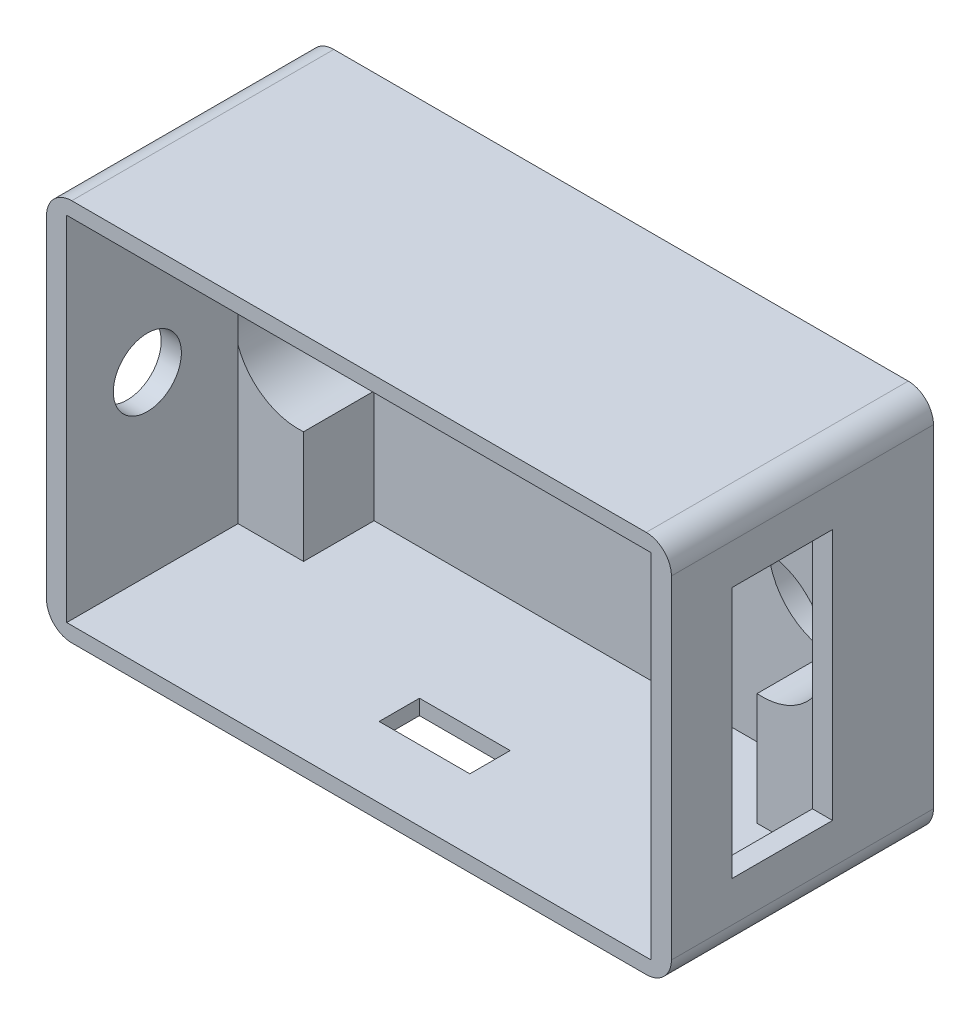
ISO-10303-21;
HEADER;
FILE_DESCRIPTION(('STEP AP214'),'2;1');
FILE_NAME('part.step','',(''),(''),'','','');
FILE_SCHEMA(('AUTOMOTIVE_DESIGN { 1 0 10303 214 1 1 1 1 }'));
ENDSEC;
DATA;
#1=APPLICATION_CONTEXT('core data for automotive mechanical design processes');
#2=APPLICATION_PROTOCOL_DEFINITION('international standard','automotive_design',2000,#1);
#3=PRODUCT_CONTEXT('',#1,'mechanical');
#4=PRODUCT('Part','Part','',(#3));
#5=PRODUCT_RELATED_PRODUCT_CATEGORY('part','',(#4));
#6=PRODUCT_DEFINITION_FORMATION('','',#4);
#7=PRODUCT_DEFINITION_CONTEXT('part definition',#1,'design');
#8=PRODUCT_DEFINITION('design','',#6,#7);
#9=PRODUCT_DEFINITION_SHAPE('','',#8);
#10=(LENGTH_UNIT() NAMED_UNIT(*) SI_UNIT(.MILLI.,.METRE.));
#11=(NAMED_UNIT(*) PLANE_ANGLE_UNIT() SI_UNIT($,.RADIAN.));
#12=(NAMED_UNIT(*) SI_UNIT($,.STERADIAN.) SOLID_ANGLE_UNIT());
#13=UNCERTAINTY_MEASURE_WITH_UNIT(LENGTH_MEASURE(1.E-05),#10,'distance_accuracy_value','');
#14=(GEOMETRIC_REPRESENTATION_CONTEXT(3) GLOBAL_UNCERTAINTY_ASSIGNED_CONTEXT((#13)) GLOBAL_UNIT_ASSIGNED_CONTEXT((#10,
#11,#12)) REPRESENTATION_CONTEXT('',''));
#15=CARTESIAN_POINT('',(0.,0.,0.));
#16=DIRECTION('',(0.,0.,1.));
#17=DIRECTION('',(1.,0.,0.));
#18=AXIS2_PLACEMENT_3D('',#15,#16,#17);
#19=CARTESIAN_POINT('',(0.,0.,9.));
#20=DIRECTION('',(0.,0.,1.));
#21=DIRECTION('',(1.,0.,0.));
#22=AXIS2_PLACEMENT_3D('',#19,#20,#21);
#23=PLANE('',#22);
#24=CARTESIAN_POINT('',(8.,19.,9.));
#25=DIRECTION('',(0.,0.,-1.));
#26=DIRECTION('',(-1.,0.,0.));
#27=AXIS2_PLACEMENT_3D('',#24,#25,#26);
#28=CIRCLE('',#27,6.375);
#29=CARTESIAN_POINT('',(2.,21.1542109924518,9.));
#30=VERTEX_POINT('',#29);
#31=CARTESIAN_POINT('',(8.5,25.3553619094431,9.));
#32=VERTEX_POINT('',#31);
#33=EDGE_CURVE('E324',#30,#32,#28,.T.);
#34=ORIENTED_EDGE('',*,*,#33,.T.);
#35=DIRECTION('',(0.,-1.,0.));
#36=VECTOR('',#35,1.);
#37=CARTESIAN_POINT('',(8.5,36.5,9.));
#38=LINE('',#37,#36);
#39=CARTESIAN_POINT('',(8.5,36.5,9.));
#40=VERTEX_POINT('',#39);
#41=EDGE_CURVE('E374',#40,#32,#38,.T.);
#42=ORIENTED_EDGE('',*,*,#41,.F.);
#43=DIRECTION('',(-1.,0.,0.));
#44=VECTOR('',#43,1.);
#45=CARTESIAN_POINT('',(2.,36.5,9.));
#46=LINE('',#45,#44);
#47=CARTESIAN_POINT('',(2.,36.5,9.));
#48=VERTEX_POINT('',#47);
#49=EDGE_CURVE('E412',#40,#48,#46,.T.);
#50=ORIENTED_EDGE('',*,*,#49,.T.);
#51=DIRECTION('',(0.,-1.,0.));
#52=VECTOR('',#51,1.);
#53=CARTESIAN_POINT('',(2.,36.5,9.));
#54=LINE('',#53,#52);
#55=EDGE_CURVE('E397',#48,#30,#54,.T.);
#56=ORIENTED_EDGE('',*,*,#55,.T.);
#57=EDGE_LOOP('',(#34,#42,#50,#56));
#58=FACE_BOUND('',#57,.T.);
#59=ADVANCED_FACE('F39',(#58),#23,.T.);
#60=CARTESIAN_POINT('',(54.,19.,9.));
#61=DIRECTION('',(0.,0.,-1.));
#62=DIRECTION('',(-1.,0.,0.));
#63=AXIS2_PLACEMENT_3D('',#60,#61,#62);
#64=CIRCLE('',#63,6.375);
#65=CARTESIAN_POINT('',(53.5,25.3553619094431,9.));
#66=VERTEX_POINT('',#65);
#67=CARTESIAN_POINT('',(60.,21.1542109924518,9.));
#68=VERTEX_POINT('',#67);
#69=EDGE_CURVE('E313',#66,#68,#64,.T.);
#70=ORIENTED_EDGE('',*,*,#69,.T.);
#71=DIRECTION('',(0.,1.,0.));
#72=VECTOR('',#71,1.);
#73=CARTESIAN_POINT('',(60.,36.5,9.));
#74=LINE('',#73,#72);
#75=CARTESIAN_POINT('',(60.,36.5,9.));
#76=VERTEX_POINT('',#75);
#77=EDGE_CURVE('E407',#68,#76,#74,.T.);
#78=ORIENTED_EDGE('',*,*,#77,.T.);
#79=CARTESIAN_POINT('',(53.5,36.5,9.));
#80=VERTEX_POINT('',#79);
#81=EDGE_CURVE('E413',#76,#80,#46,.T.);
#82=ORIENTED_EDGE('',*,*,#81,.T.);
#83=DIRECTION('',(0.,1.,0.));
#84=VECTOR('',#83,1.);
#85=CARTESIAN_POINT('',(53.5,36.5,9.));
#86=LINE('',#85,#84);
#87=EDGE_CURVE('E378',#66,#80,#86,.T.);
#88=ORIENTED_EDGE('',*,*,#87,.F.);
#89=EDGE_LOOP('',(#70,#78,#82,#88));
#90=FACE_BOUND('',#89,.T.);
#91=ADVANCED_FACE('F593',(#90),#23,.T.);
#92=CARTESIAN_POINT('',(8.5,36.5,2.));
#93=DIRECTION('',(-1.,0.,0.));
#94=DIRECTION('',(0.,-1.,0.));
#95=AXIS2_PLACEMENT_3D('',#92,#93,#94);
#96=PLANE('',#95);
#97=ORIENTED_EDGE('',*,*,#41,.T.);
#98=DIRECTION('',(0.,0.,-1.));
#99=VECTOR('',#98,1.);
#100=CARTESIAN_POINT('',(8.5,25.3553619094431,9.));
#101=LINE('',#100,#99);
#102=CARTESIAN_POINT('',(8.5,25.3553619094431,2.));
#103=VERTEX_POINT('',#102);
#104=EDGE_CURVE('E336',#32,#103,#101,.T.);
#105=ORIENTED_EDGE('',*,*,#104,.T.);
#106=DIRECTION('',(0.,-1.,0.));
#107=VECTOR('',#106,1.);
#108=CARTESIAN_POINT('',(8.5,36.5,2.));
#109=LINE('',#108,#107);
#110=CARTESIAN_POINT('',(8.5,36.5,2.));
#111=VERTEX_POINT('',#110);
#112=EDGE_CURVE('E355',#111,#103,#109,.T.);
#113=ORIENTED_EDGE('',*,*,#112,.F.);
#114=DIRECTION('',(0.,0.,1.));
#115=VECTOR('',#114,1.);
#116=CARTESIAN_POINT('',(8.5,36.5,2.));
#117=LINE('',#116,#115);
#118=EDGE_CURVE('E383',#111,#40,#117,.T.);
#119=ORIENTED_EDGE('',*,*,#118,.T.);
#120=EDGE_LOOP('',(#97,#105,#113,#119));
#121=FACE_BOUND('',#120,.T.);
#122=ADVANCED_FACE('F600',(#121),#96,.F.);
#123=CARTESIAN_POINT('',(53.5,36.5,2.));
#124=DIRECTION('',(1.,0.,0.));
#125=DIRECTION('',(0.,1.,0.));
#126=AXIS2_PLACEMENT_3D('',#123,#124,#125);
#127=PLANE('',#126);
#128=CARTESIAN_POINT('',(53.5,1.49999999999999,9.));
#129=VERTEX_POINT('',#128);
#130=CARTESIAN_POINT('',(53.5,12.6446380905569,9.));
#131=VERTEX_POINT('',#130);
#132=EDGE_CURVE('E379',#129,#131,#86,.T.);
#133=ORIENTED_EDGE('',*,*,#132,.T.);
#134=DIRECTION('',(0.,0.,-1.));
#135=VECTOR('',#134,1.);
#136=CARTESIAN_POINT('',(53.5,12.6446380905569,9.));
#137=LINE('',#136,#135);
#138=CARTESIAN_POINT('',(53.5,12.6446380905569,2.));
#139=VERTEX_POINT('',#138);
#140=EDGE_CURVE('E344',#131,#139,#137,.T.);
#141=ORIENTED_EDGE('',*,*,#140,.T.);
#142=DIRECTION('',(0.,1.,0.));
#143=VECTOR('',#142,1.);
#144=CARTESIAN_POINT('',(53.5,36.5,2.));
#145=LINE('',#144,#143);
#146=CARTESIAN_POINT('',(53.5,1.49999999999999,2.));
#147=VERTEX_POINT('',#146);
#148=EDGE_CURVE('E365',#147,#139,#145,.T.);
#149=ORIENTED_EDGE('',*,*,#148,.F.);
#150=DIRECTION('',(0.,0.,1.));
#151=VECTOR('',#150,1.);
#152=CARTESIAN_POINT('',(53.5,1.49999999999999,2.));
#153=LINE('',#152,#151);
#154=EDGE_CURVE('E391',#147,#129,#153,.T.);
#155=ORIENTED_EDGE('',*,*,#154,.T.);
#156=EDGE_LOOP('',(#133,#141,#149,#155));
#157=FACE_BOUND('',#156,.T.);
#158=ADVANCED_FACE('F620',(#157),#127,.F.);
#159=CARTESIAN_POINT('',(8.5,12.6446380905569,9.));
#160=VERTEX_POINT('',#159);
#161=CARTESIAN_POINT('',(2.,16.8457890075482,9.));
#162=VERTEX_POINT('',#161);
#163=EDGE_CURVE('E328',#160,#162,#28,.T.);
#164=ORIENTED_EDGE('',*,*,#163,.T.);
#165=CARTESIAN_POINT('',(2.,1.49999999999999,9.));
#166=VERTEX_POINT('',#165);
#167=EDGE_CURVE('E402',#162,#166,#54,.T.);
#168=ORIENTED_EDGE('',*,*,#167,.T.);
#169=DIRECTION('',(1.,0.,0.));
#170=VECTOR('',#169,1.);
#171=CARTESIAN_POINT('',(2.,1.49999999999999,9.));
#172=LINE('',#171,#170);
#173=CARTESIAN_POINT('',(8.5,1.49999999999999,9.));
#174=VERTEX_POINT('',#173);
#175=EDGE_CURVE('E403',#166,#174,#172,.T.);
#176=ORIENTED_EDGE('',*,*,#175,.T.);
#177=EDGE_CURVE('E354',#160,#174,#38,.T.);
#178=ORIENTED_EDGE('',*,*,#177,.F.);
#179=EDGE_LOOP('',(#164,#168,#176,#178));
#180=FACE_BOUND('',#179,.T.);
#181=ADVANCED_FACE('F602',(#180),#23,.T.);
#182=CARTESIAN_POINT('',(0.,0.,26.));
#183=DIRECTION('',(1.,0.,0.));
#184=DIRECTION('',(0.,0.,-1.));
#185=AXIS2_PLACEMENT_3D('',#182,#183,#184);
#186=PLANE('',#185);
#187=CARTESIAN_POINT('',(0.,19.,18.));
#188=DIRECTION('',(-1.,0.,0.));
#189=DIRECTION('',(0.,0.,1.));
#190=AXIS2_PLACEMENT_3D('',#187,#188,#189);
#191=CIRCLE('',#190,3.375);
#192=CARTESIAN_POINT('',(0.,19.,21.375));
#193=VERTEX_POINT('',#192);
#194=EDGE_CURVE('E275',#193,#193,#191,.T.);
#195=ORIENTED_EDGE('',*,*,#194,.F.);
#196=EDGE_LOOP('',(#195));
#197=FACE_BOUND('',#196,.T.);
#198=DIRECTION('',(0.,-1.,0.));
#199=VECTOR('',#198,1.);
#200=CARTESIAN_POINT('',(0.,0.,0.));
#201=LINE('',#200,#199);
#202=CARTESIAN_POINT('',(0.,35.5,0.));
#203=VERTEX_POINT('',#202);
#204=CARTESIAN_POINT('',(0.,2.5,0.));
#205=VERTEX_POINT('',#204);
#206=EDGE_CURVE('E435',#203,#205,#201,.T.);
#207=ORIENTED_EDGE('',*,*,#206,.T.);
#208=DIRECTION('',(0.,0.,-1.));
#209=VECTOR('',#208,1.);
#210=CARTESIAN_POINT('',(0.,2.5,26.));
#211=LINE('',#210,#209);
#212=CARTESIAN_POINT('',(0.,2.5,26.));
#213=VERTEX_POINT('',#212);
#214=EDGE_CURVE('E11',#205,#213,#211,.F.);
#215=ORIENTED_EDGE('',*,*,#214,.T.);
#216=DIRECTION('',(0.,-1.,0.));
#217=VECTOR('',#216,1.);
#218=CARTESIAN_POINT('',(0.,0.,26.));
#219=LINE('',#218,#217);
#220=CARTESIAN_POINT('',(0.,35.5,26.));
#221=VERTEX_POINT('',#220);
#222=EDGE_CURVE('E445',#221,#213,#219,.T.);
#223=ORIENTED_EDGE('',*,*,#222,.F.);
#224=DIRECTION('',(0.,0.,-1.));
#225=VECTOR('',#224,1.);
#226=CARTESIAN_POINT('',(0.,35.5,26.));
#227=LINE('',#226,#225);
#228=EDGE_CURVE('E48',#221,#203,#227,.T.);
#229=ORIENTED_EDGE('',*,*,#228,.T.);
#230=EDGE_LOOP('',(#207,#215,#223,#229));
#231=FACE_BOUND('',#230,.T.);
#232=ADVANCED_FACE('F559',(#197,#231),#186,.F.);
#233=CARTESIAN_POINT('',(0.,0.,26.));
#234=DIRECTION('',(0.,1.,0.));
#235=DIRECTION('',(0.,0.,1.));
#236=AXIS2_PLACEMENT_3D('',#233,#234,#235);
#237=PLANE('',#236);
#238=DIRECTION('',(1.,0.,0.));
#239=VECTOR('',#238,1.);
#240=CARTESIAN_POINT('',(26.,0.,15.));
#241=LINE('',#240,#239);
#242=CARTESIAN_POINT('',(26.,0.,15.));
#243=VERTEX_POINT('',#242);
#244=CARTESIAN_POINT('',(35.,0.,15.));
#245=VERTEX_POINT('',#244);
#246=EDGE_CURVE('E255',#243,#245,#241,.T.);
#247=ORIENTED_EDGE('',*,*,#246,.F.);
#248=DIRECTION('',(0.,0.,-1.));
#249=VECTOR('',#248,1.);
#250=CARTESIAN_POINT('',(26.,0.,19.));
#251=LINE('',#250,#249);
#252=CARTESIAN_POINT('',(26.,0.,19.));
#253=VERTEX_POINT('',#252);
#254=EDGE_CURVE('E261',#253,#243,#251,.T.);
#255=ORIENTED_EDGE('',*,*,#254,.F.);
#256=DIRECTION('',(-1.,0.,0.));
#257=VECTOR('',#256,1.);
#258=CARTESIAN_POINT('',(26.,0.,19.));
#259=LINE('',#258,#257);
#260=CARTESIAN_POINT('',(35.,0.,19.));
#261=VERTEX_POINT('',#260);
#262=EDGE_CURVE('E265',#261,#253,#259,.T.);
#263=ORIENTED_EDGE('',*,*,#262,.F.);
#264=DIRECTION('',(0.,0.,1.));
#265=VECTOR('',#264,1.);
#266=CARTESIAN_POINT('',(35.,0.,19.));
#267=LINE('',#266,#265);
#268=EDGE_CURVE('E243',#245,#261,#267,.T.);
#269=ORIENTED_EDGE('',*,*,#268,.F.);
#270=EDGE_LOOP('',(#247,#255,#263,#269));
#271=FACE_BOUND('',#270,.T.);
#272=DIRECTION('',(1.,0.,0.));
#273=VECTOR('',#272,1.);
#274=CARTESIAN_POINT('',(0.,0.,0.));
#275=LINE('',#274,#273);
#276=CARTESIAN_POINT('',(2.5,0.,0.));
#277=VERTEX_POINT('',#276);
#278=CARTESIAN_POINT('',(59.5,0.,0.));
#279=VERTEX_POINT('',#278);
#280=EDGE_CURVE('E464',#277,#279,#275,.T.);
#281=ORIENTED_EDGE('',*,*,#280,.T.);
#282=DIRECTION('',(0.,0.,-1.));
#283=VECTOR('',#282,1.);
#284=CARTESIAN_POINT('',(59.5,0.,26.));
#285=LINE('',#284,#283);
#286=CARTESIAN_POINT('',(59.5,0.,26.));
#287=VERTEX_POINT('',#286);
#288=EDGE_CURVE('E55',#279,#287,#285,.F.);
#289=ORIENTED_EDGE('',*,*,#288,.T.);
#290=DIRECTION('',(1.,0.,0.));
#291=VECTOR('',#290,1.);
#292=CARTESIAN_POINT('',(0.,0.,26.));
#293=LINE('',#292,#291);
#294=CARTESIAN_POINT('',(2.5,0.,26.));
#295=VERTEX_POINT('',#294);
#296=EDGE_CURVE('E448',#295,#287,#293,.T.);
#297=ORIENTED_EDGE('',*,*,#296,.F.);
#298=DIRECTION('',(0.,0.,-1.));
#299=VECTOR('',#298,1.);
#300=CARTESIAN_POINT('',(2.5,0.,26.));
#301=LINE('',#300,#299);
#302=EDGE_CURVE('E548',#295,#277,#301,.T.);
#303=ORIENTED_EDGE('',*,*,#302,.T.);
#304=EDGE_LOOP('',(#281,#289,#297,#303));
#305=FACE_BOUND('',#304,.T.);
#306=ADVANCED_FACE('F263',(#271,#305),#237,.F.);
#307=CARTESIAN_POINT('',(62.,0.,26.));
#308=DIRECTION('',(-1.,0.,0.));
#309=DIRECTION('',(0.,0.,1.));
#310=AXIS2_PLACEMENT_3D('',#307,#308,#309);
#311=PLANE('',#310);
#312=DIRECTION('',(0.,0.,-1.));
#313=VECTOR('',#312,1.);
#314=CARTESIAN_POINT('',(62.,6.5,20.));
#315=LINE('',#314,#313);
#316=CARTESIAN_POINT('',(62.,6.5,20.));
#317=VERTEX_POINT('',#316);
#318=CARTESIAN_POINT('',(62.,6.5,10.0106629717915));
#319=VERTEX_POINT('',#318);
#320=EDGE_CURVE('E287',#317,#319,#315,.T.);
#321=ORIENTED_EDGE('',*,*,#320,.F.);
#322=DIRECTION('',(0.,-1.,0.));
#323=VECTOR('',#322,1.);
#324=CARTESIAN_POINT('',(62.,31.5,20.));
#325=LINE('',#324,#323);
#326=CARTESIAN_POINT('',(62.,31.5,20.));
#327=VERTEX_POINT('',#326);
#328=EDGE_CURVE('E284',#327,#317,#325,.T.);
#329=ORIENTED_EDGE('',*,*,#328,.F.);
#330=DIRECTION('',(0.,0.,1.));
#331=VECTOR('',#330,1.);
#332=CARTESIAN_POINT('',(62.,31.5,20.));
#333=LINE('',#332,#331);
#334=CARTESIAN_POINT('',(62.,31.5,10.0106629717915));
#335=VERTEX_POINT('',#334);
#336=EDGE_CURVE('E295',#335,#327,#333,.T.);
#337=ORIENTED_EDGE('',*,*,#336,.F.);
#338=DIRECTION('',(0.,1.,0.));
#339=VECTOR('',#338,1.);
#340=CARTESIAN_POINT('',(62.,31.5,10.0106629717915));
#341=LINE('',#340,#339);
#342=EDGE_CURVE('E291',#319,#335,#341,.T.);
#343=ORIENTED_EDGE('',*,*,#342,.F.);
#344=EDGE_LOOP('',(#321,#329,#337,#343));
#345=FACE_BOUND('',#344,.T.);
#346=DIRECTION('',(0.,1.,0.));
#347=VECTOR('',#346,1.);
#348=CARTESIAN_POINT('',(62.,0.,0.));
#349=LINE('',#348,#347);
#350=CARTESIAN_POINT('',(62.,2.5,0.));
#351=VERTEX_POINT('',#350);
#352=CARTESIAN_POINT('',(62.,35.5,0.));
#353=VERTEX_POINT('',#352);
#354=EDGE_CURVE('E467',#351,#353,#349,.T.);
#355=ORIENTED_EDGE('',*,*,#354,.T.);
#356=DIRECTION('',(0.,0.,-1.));
#357=VECTOR('',#356,1.);
#358=CARTESIAN_POINT('',(62.,35.5,26.));
#359=LINE('',#358,#357);
#360=CARTESIAN_POINT('',(62.,35.5,26.));
#361=VERTEX_POINT('',#360);
#362=EDGE_CURVE('E534',#353,#361,#359,.F.);
#363=ORIENTED_EDGE('',*,*,#362,.T.);
#364=DIRECTION('',(0.,1.,0.));
#365=VECTOR('',#364,1.);
#366=CARTESIAN_POINT('',(62.,0.,26.));
#367=LINE('',#366,#365);
#368=CARTESIAN_POINT('',(62.,2.5,26.));
#369=VERTEX_POINT('',#368);
#370=EDGE_CURVE('E452',#369,#361,#367,.T.);
#371=ORIENTED_EDGE('',*,*,#370,.F.);
#372=DIRECTION('',(0.,0.,-1.));
#373=VECTOR('',#372,1.);
#374=CARTESIAN_POINT('',(62.,2.5,26.));
#375=LINE('',#374,#373);
#376=EDGE_CURVE('E530',#369,#351,#375,.T.);
#377=ORIENTED_EDGE('',*,*,#376,.T.);
#378=EDGE_LOOP('',(#355,#363,#371,#377));
#379=FACE_BOUND('',#378,.T.);
#380=ADVANCED_FACE('F578',(#345,#379),#311,.F.);
#381=CARTESIAN_POINT('',(0.,38.,26.));
#382=DIRECTION('',(0.,-1.,0.));
#383=DIRECTION('',(0.,0.,-1.));
#384=AXIS2_PLACEMENT_3D('',#381,#382,#383);
#385=PLANE('',#384);
#386=DIRECTION('',(-1.,0.,0.));
#387=VECTOR('',#386,1.);
#388=CARTESIAN_POINT('',(0.,38.,26.));
#389=LINE('',#388,#387);
#390=CARTESIAN_POINT('',(59.5,38.,26.));
#391=VERTEX_POINT('',#390);
#392=CARTESIAN_POINT('',(2.5,38.,26.));
#393=VERTEX_POINT('',#392);
#394=EDGE_CURVE('E456',#391,#393,#389,.T.);
#395=ORIENTED_EDGE('',*,*,#394,.F.);
#396=DIRECTION('',(0.,0.,-1.));
#397=VECTOR('',#396,1.);
#398=CARTESIAN_POINT('',(59.5,38.,26.));
#399=LINE('',#398,#397);
#400=CARTESIAN_POINT('',(59.5,38.,0.));
#401=VERTEX_POINT('',#400);
#402=EDGE_CURVE('E514',#391,#401,#399,.T.);
#403=ORIENTED_EDGE('',*,*,#402,.T.);
#404=DIRECTION('',(-1.,0.,0.));
#405=VECTOR('',#404,1.);
#406=CARTESIAN_POINT('',(0.,38.,0.));
#407=LINE('',#406,#405);
#408=CARTESIAN_POINT('',(2.5,38.,0.));
#409=VERTEX_POINT('',#408);
#410=EDGE_CURVE('E449',#401,#409,#407,.T.);
#411=ORIENTED_EDGE('',*,*,#410,.T.);
#412=DIRECTION('',(0.,0.,-1.));
#413=VECTOR('',#412,1.);
#414=CARTESIAN_POINT('',(2.5,38.,26.));
#415=LINE('',#414,#413);
#416=EDGE_CURVE('E511',#409,#393,#415,.F.);
#417=ORIENTED_EDGE('',*,*,#416,.T.);
#418=EDGE_LOOP('',(#395,#403,#411,#417));
#419=FACE_BOUND('',#418,.T.);
#420=ADVANCED_FACE('F586',(#419),#385,.F.);
#421=CARTESIAN_POINT('',(0.,0.,26.));
#422=DIRECTION('',(0.,0.,-1.));
#423=DIRECTION('',(-1.,0.,0.));
#424=AXIS2_PLACEMENT_3D('',#421,#422,#423);
#425=PLANE('',#424);
#426=DIRECTION('',(1.,0.,0.));
#427=VECTOR('',#426,1.);
#428=CARTESIAN_POINT('',(2.,1.49999999999999,26.));
#429=LINE('',#428,#427);
#430=CARTESIAN_POINT('',(2.,1.49999999999999,26.));
#431=VERTEX_POINT('',#430);
#432=CARTESIAN_POINT('',(60.,1.49999999999999,26.));
#433=VERTEX_POINT('',#432);
#434=EDGE_CURVE('E420',#431,#433,#429,.T.);
#435=ORIENTED_EDGE('',*,*,#434,.F.);
#436=DIRECTION('',(0.,-1.,0.));
#437=VECTOR('',#436,1.);
#438=CARTESIAN_POINT('',(2.,36.5,26.));
#439=LINE('',#438,#437);
#440=CARTESIAN_POINT('',(2.,36.5,26.));
#441=VERTEX_POINT('',#440);
#442=EDGE_CURVE('E386',#441,#431,#439,.T.);
#443=ORIENTED_EDGE('',*,*,#442,.F.);
#444=DIRECTION('',(-1.,0.,0.));
#445=VECTOR('',#444,1.);
#446=CARTESIAN_POINT('',(2.,36.5,26.));
#447=LINE('',#446,#445);
#448=CARTESIAN_POINT('',(60.,36.5,26.));
#449=VERTEX_POINT('',#448);
#450=EDGE_CURVE('E428',#449,#441,#447,.T.);
#451=ORIENTED_EDGE('',*,*,#450,.F.);
#452=DIRECTION('',(0.,1.,0.));
#453=VECTOR('',#452,1.);
#454=CARTESIAN_POINT('',(60.,36.5,26.));
#455=LINE('',#454,#453);
#456=EDGE_CURVE('E424',#433,#449,#455,.T.);
#457=ORIENTED_EDGE('',*,*,#456,.F.);
#458=EDGE_LOOP('',(#435,#443,#451,#457));
#459=FACE_BOUND('',#458,.T.);
#460=ORIENTED_EDGE('',*,*,#370,.T.);
#461=CARTESIAN_POINT('',(59.5,35.5,26.));
#462=DIRECTION('',(0.,0.,-1.));
#463=DIRECTION('',(-1.,0.,0.));
#464=AXIS2_PLACEMENT_3D('',#461,#462,#463);
#465=CIRCLE('',#464,2.5);
#466=EDGE_CURVE('E545',#361,#391,#465,.F.);
#467=ORIENTED_EDGE('',*,*,#466,.T.);
#468=ORIENTED_EDGE('',*,*,#394,.T.);
#469=CARTESIAN_POINT('',(2.5,35.5,26.));
#470=DIRECTION('',(0.,0.,-1.));
#471=DIRECTION('',(-1.,0.,0.));
#472=AXIS2_PLACEMENT_3D('',#469,#470,#471);
#473=CIRCLE('',#472,2.5);
#474=EDGE_CURVE('E537',#393,#221,#473,.F.);
#475=ORIENTED_EDGE('',*,*,#474,.T.);
#476=ORIENTED_EDGE('',*,*,#222,.T.);
#477=CARTESIAN_POINT('',(2.5,2.5,26.));
#478=DIRECTION('',(0.,0.,-1.));
#479=DIRECTION('',(-1.,0.,0.));
#480=AXIS2_PLACEMENT_3D('',#477,#478,#479);
#481=CIRCLE('',#480,2.5);
#482=EDGE_CURVE('E62',#213,#295,#481,.F.);
#483=ORIENTED_EDGE('',*,*,#482,.T.);
#484=ORIENTED_EDGE('',*,*,#296,.T.);
#485=CARTESIAN_POINT('',(59.5,2.5,26.));
#486=DIRECTION('',(0.,0.,-1.));
#487=DIRECTION('',(-1.,0.,0.));
#488=AXIS2_PLACEMENT_3D('',#485,#486,#487);
#489=CIRCLE('',#488,2.5);
#490=EDGE_CURVE('E542',#287,#369,#489,.F.);
#491=ORIENTED_EDGE('',*,*,#490,.T.);
#492=EDGE_LOOP('',(#460,#467,#468,#475,#476,#483,#484,#491));
#493=FACE_BOUND('',#492,.T.);
#494=ADVANCED_FACE('F571',(#459,#493),#425,.F.);
#495=CARTESIAN_POINT('',(0.,0.,0.));
#496=DIRECTION('',(0.,0.,-1.));
#497=DIRECTION('',(-1.,0.,0.));
#498=AXIS2_PLACEMENT_3D('',#495,#496,#497);
#499=PLANE('',#498);
#500=CARTESIAN_POINT('',(54.,19.,0.));
#501=DIRECTION('',(0.,0.,-1.));
#502=DIRECTION('',(-1.,0.,0.));
#503=AXIS2_PLACEMENT_3D('',#500,#501,#502);
#504=CIRCLE('',#503,6.375);
#505=CARTESIAN_POINT('',(47.625,19.,0.));
#506=VERTEX_POINT('',#505);
#507=EDGE_CURVE('E320',#506,#506,#504,.T.);
#508=ORIENTED_EDGE('',*,*,#507,.F.);
#509=EDGE_LOOP('',(#508));
#510=FACE_BOUND('',#509,.T.);
#511=CARTESIAN_POINT('',(8.,19.,0.));
#512=DIRECTION('',(0.,0.,-1.));
#513=DIRECTION('',(-1.,0.,0.));
#514=AXIS2_PLACEMENT_3D('',#511,#512,#513);
#515=CIRCLE('',#514,6.375);
#516=CARTESIAN_POINT('',(1.625,19.,0.));
#517=VERTEX_POINT('',#516);
#518=EDGE_CURVE('E303',#517,#517,#515,.T.);
#519=ORIENTED_EDGE('',*,*,#518,.F.);
#520=EDGE_LOOP('',(#519));
#521=FACE_BOUND('',#520,.T.);
#522=ORIENTED_EDGE('',*,*,#410,.F.);
#523=CARTESIAN_POINT('',(59.5,35.5,0.));
#524=DIRECTION('',(0.,0.,-1.));
#525=DIRECTION('',(-1.,0.,0.));
#526=AXIS2_PLACEMENT_3D('',#523,#524,#525);
#527=CIRCLE('',#526,2.5);
#528=EDGE_CURVE('E527',#401,#353,#527,.T.);
#529=ORIENTED_EDGE('',*,*,#528,.T.);
#530=ORIENTED_EDGE('',*,*,#354,.F.);
#531=CARTESIAN_POINT('',(59.5,2.5,0.));
#532=DIRECTION('',(0.,0.,-1.));
#533=DIRECTION('',(-1.,0.,0.));
#534=AXIS2_PLACEMENT_3D('',#531,#532,#533);
#535=CIRCLE('',#534,2.5);
#536=EDGE_CURVE('E524',#351,#279,#535,.T.);
#537=ORIENTED_EDGE('',*,*,#536,.T.);
#538=ORIENTED_EDGE('',*,*,#280,.F.);
#539=CARTESIAN_POINT('',(2.5,2.5,0.));
#540=DIRECTION('',(0.,0.,-1.));
#541=DIRECTION('',(-1.,0.,0.));
#542=AXIS2_PLACEMENT_3D('',#539,#540,#541);
#543=CIRCLE('',#542,2.5);
#544=EDGE_CURVE('E521',#277,#205,#543,.T.);
#545=ORIENTED_EDGE('',*,*,#544,.T.);
#546=ORIENTED_EDGE('',*,*,#206,.F.);
#547=CARTESIAN_POINT('',(2.5,35.5,0.));
#548=DIRECTION('',(0.,0.,-1.));
#549=DIRECTION('',(-1.,0.,0.));
#550=AXIS2_PLACEMENT_3D('',#547,#548,#549);
#551=CIRCLE('',#550,2.5);
#552=EDGE_CURVE('E518',#203,#409,#551,.T.);
#553=ORIENTED_EDGE('',*,*,#552,.T.);
#554=EDGE_LOOP('',(#522,#529,#530,#537,#538,#545,#546,#553));
#555=FACE_BOUND('',#554,.T.);
#556=ADVANCED_FACE('F565',(#510,#521,#555),#499,.T.);
#557=CARTESIAN_POINT('',(2.,36.5,9.));
#558=DIRECTION('',(-1.,0.,0.));
#559=DIRECTION('',(0.,-1.,0.));
#560=AXIS2_PLACEMENT_3D('',#557,#558,#559);
#561=PLANE('',#560);
#562=CARTESIAN_POINT('',(2.,19.,18.));
#563=DIRECTION('',(-1.,0.,0.));
#564=DIRECTION('',(0.,-1.,0.));
#565=AXIS2_PLACEMENT_3D('',#562,#563,#564);
#566=CIRCLE('',#565,3.375);
#567=CARTESIAN_POINT('',(2.,15.625,18.));
#568=VERTEX_POINT('',#567);
#569=EDGE_CURVE('E283',#568,#568,#566,.T.);
#570=ORIENTED_EDGE('',*,*,#569,.T.);
#571=EDGE_LOOP('',(#570));
#572=FACE_BOUND('',#571,.T.);
#573=ORIENTED_EDGE('',*,*,#442,.T.);
#574=DIRECTION('',(0.,0.,1.));
#575=VECTOR('',#574,1.);
#576=CARTESIAN_POINT('',(2.,1.49999999999999,9.));
#577=LINE('',#576,#575);
#578=EDGE_CURVE('E417',#166,#431,#577,.T.);
#579=ORIENTED_EDGE('',*,*,#578,.F.);
#580=ORIENTED_EDGE('',*,*,#167,.F.);
#581=DIRECTION('',(0.,-1.,0.));
#582=VECTOR('',#581,1.);
#583=CARTESIAN_POINT('',(2.,36.5,9.));
#584=LINE('',#583,#582);
#585=EDGE_CURVE('E351',#30,#162,#584,.T.);
#586=ORIENTED_EDGE('',*,*,#585,.F.);
#587=ORIENTED_EDGE('',*,*,#55,.F.);
#588=DIRECTION('',(0.,0.,1.));
#589=VECTOR('',#588,1.);
#590=CARTESIAN_POINT('',(2.,36.5,9.));
#591=LINE('',#590,#589);
#592=EDGE_CURVE('E432',#48,#441,#591,.T.);
#593=ORIENTED_EDGE('',*,*,#592,.T.);
#594=EDGE_LOOP('',(#573,#579,#580,#586,#587,#593));
#595=FACE_BOUND('',#594,.T.);
#596=ADVANCED_FACE('F639',(#572,#595),#561,.F.);
#597=CARTESIAN_POINT('',(2.,36.5,9.));
#598=DIRECTION('',(0.,1.,0.));
#599=DIRECTION('',(0.,0.,1.));
#600=AXIS2_PLACEMENT_3D('',#597,#598,#599);
#601=PLANE('',#600);
#602=ORIENTED_EDGE('',*,*,#450,.T.);
#603=ORIENTED_EDGE('',*,*,#592,.F.);
#604=ORIENTED_EDGE('',*,*,#49,.F.);
#605=ORIENTED_EDGE('',*,*,#118,.F.);
#606=DIRECTION('',(-1.,0.,0.));
#607=VECTOR('',#606,1.);
#608=CARTESIAN_POINT('',(8.5,36.5,2.));
#609=LINE('',#608,#607);
#610=CARTESIAN_POINT('',(53.5,36.5,2.));
#611=VERTEX_POINT('',#610);
#612=EDGE_CURVE('E369',#611,#111,#609,.T.);
#613=ORIENTED_EDGE('',*,*,#612,.F.);
#614=DIRECTION('',(0.,0.,1.));
#615=VECTOR('',#614,1.);
#616=CARTESIAN_POINT('',(53.5,36.5,2.));
#617=LINE('',#616,#615);
#618=EDGE_CURVE('E387',#611,#80,#617,.T.);
#619=ORIENTED_EDGE('',*,*,#618,.T.);
#620=ORIENTED_EDGE('',*,*,#81,.F.);
#621=DIRECTION('',(0.,0.,1.));
#622=VECTOR('',#621,1.);
#623=CARTESIAN_POINT('',(60.,36.5,9.));
#624=LINE('',#623,#622);
#625=EDGE_CURVE('E436',#76,#449,#624,.T.);
#626=ORIENTED_EDGE('',*,*,#625,.T.);
#627=EDGE_LOOP('',(#602,#603,#604,#605,#613,#619,#620,#626));
#628=FACE_BOUND('',#627,.T.);
#629=ADVANCED_FACE('F662',(#628),#601,.F.);
#630=CARTESIAN_POINT('',(60.,36.5,9.));
#631=DIRECTION('',(1.,0.,0.));
#632=DIRECTION('',(0.,1.,0.));
#633=AXIS2_PLACEMENT_3D('',#630,#631,#632);
#634=PLANE('',#633);
#635=DIRECTION('',(0.,0.,1.));
#636=VECTOR('',#635,1.);
#637=CARTESIAN_POINT('',(60.,31.5,9.));
#638=LINE('',#637,#636);
#639=CARTESIAN_POINT('',(60.,31.5,10.0106629717915));
#640=VERTEX_POINT('',#639);
#641=CARTESIAN_POINT('',(60.,31.5,20.));
#642=VERTEX_POINT('',#641);
#643=EDGE_CURVE('E487',#640,#642,#638,.T.);
#644=ORIENTED_EDGE('',*,*,#643,.T.);
#645=DIRECTION('',(0.,-1.,0.));
#646=VECTOR('',#645,1.);
#647=CARTESIAN_POINT('',(60.,36.5,20.));
#648=LINE('',#647,#646);
#649=CARTESIAN_POINT('',(60.,6.5,20.));
#650=VERTEX_POINT('',#649);
#651=EDGE_CURVE('E491',#642,#650,#648,.T.);
#652=ORIENTED_EDGE('',*,*,#651,.T.);
#653=DIRECTION('',(0.,0.,-1.));
#654=VECTOR('',#653,1.);
#655=CARTESIAN_POINT('',(60.,6.5,9.));
#656=LINE('',#655,#654);
#657=CARTESIAN_POINT('',(60.,6.5,10.0106629717915));
#658=VERTEX_POINT('',#657);
#659=EDGE_CURVE('E479',#650,#658,#656,.T.);
#660=ORIENTED_EDGE('',*,*,#659,.T.);
#661=DIRECTION('',(0.,1.,0.));
#662=VECTOR('',#661,1.);
#663=CARTESIAN_POINT('',(60.,36.5,10.0106629717915));
#664=LINE('',#663,#662);
#665=EDGE_CURVE('E483',#658,#640,#664,.T.);
#666=ORIENTED_EDGE('',*,*,#665,.T.);
#667=EDGE_LOOP('',(#644,#652,#660,#666));
#668=FACE_BOUND('',#667,.T.);
#669=ORIENTED_EDGE('',*,*,#456,.T.);
#670=ORIENTED_EDGE('',*,*,#625,.F.);
#671=ORIENTED_EDGE('',*,*,#77,.F.);
#672=DIRECTION('',(0.,1.,0.));
#673=VECTOR('',#672,1.);
#674=CARTESIAN_POINT('',(60.,36.5,9.));
#675=LINE('',#674,#673);
#676=CARTESIAN_POINT('',(60.,16.8457890075482,9.));
#677=VERTEX_POINT('',#676);
#678=EDGE_CURVE('E348',#677,#68,#675,.T.);
#679=ORIENTED_EDGE('',*,*,#678,.F.);
#680=CARTESIAN_POINT('',(60.,1.49999999999999,9.));
#681=VERTEX_POINT('',#680);
#682=EDGE_CURVE('E408',#681,#677,#74,.T.);
#683=ORIENTED_EDGE('',*,*,#682,.F.);
#684=DIRECTION('',(0.,0.,1.));
#685=VECTOR('',#684,1.);
#686=CARTESIAN_POINT('',(60.,1.49999999999999,9.));
#687=LINE('',#686,#685);
#688=EDGE_CURVE('E439',#681,#433,#687,.T.);
#689=ORIENTED_EDGE('',*,*,#688,.T.);
#690=EDGE_LOOP('',(#669,#670,#671,#679,#683,#689));
#691=FACE_BOUND('',#690,.T.);
#692=ADVANCED_FACE('F615',(#668,#691),#634,.F.);
#693=CARTESIAN_POINT('',(2.,1.49999999999999,9.));
#694=DIRECTION('',(0.,-1.,0.));
#695=DIRECTION('',(1.,0.,0.));
#696=AXIS2_PLACEMENT_3D('',#693,#694,#695);
#697=PLANE('',#696);
#698=DIRECTION('',(-1.,0.,0.));
#699=VECTOR('',#698,1.);
#700=CARTESIAN_POINT('',(2.,1.49999999999999,19.));
#701=LINE('',#700,#699);
#702=CARTESIAN_POINT('',(35.,1.49999999999999,19.));
#703=VERTEX_POINT('',#702);
#704=CARTESIAN_POINT('',(26.,1.49999999999999,19.));
#705=VERTEX_POINT('',#704);
#706=EDGE_CURVE('E503',#703,#705,#701,.T.);
#707=ORIENTED_EDGE('',*,*,#706,.T.);
#708=DIRECTION('',(0.,0.,-1.));
#709=VECTOR('',#708,1.);
#710=CARTESIAN_POINT('',(26.,1.49999999999999,9.));
#711=LINE('',#710,#709);
#712=CARTESIAN_POINT('',(26.,1.49999999999999,15.));
#713=VERTEX_POINT('',#712);
#714=EDGE_CURVE('E507',#705,#713,#711,.T.);
#715=ORIENTED_EDGE('',*,*,#714,.T.);
#716=DIRECTION('',(1.,0.,0.));
#717=VECTOR('',#716,1.);
#718=CARTESIAN_POINT('',(2.,1.49999999999999,15.));
#719=LINE('',#718,#717);
#720=CARTESIAN_POINT('',(35.,1.49999999999999,15.));
#721=VERTEX_POINT('',#720);
#722=EDGE_CURVE('E495',#713,#721,#719,.T.);
#723=ORIENTED_EDGE('',*,*,#722,.T.);
#724=DIRECTION('',(0.,0.,1.));
#725=VECTOR('',#724,1.);
#726=CARTESIAN_POINT('',(35.,1.49999999999999,9.));
#727=LINE('',#726,#725);
#728=EDGE_CURVE('E246',#721,#703,#727,.T.);
#729=ORIENTED_EDGE('',*,*,#728,.T.);
#730=EDGE_LOOP('',(#707,#715,#723,#729));
#731=FACE_BOUND('',#730,.T.);
#732=ORIENTED_EDGE('',*,*,#434,.T.);
#733=ORIENTED_EDGE('',*,*,#688,.F.);
#734=EDGE_CURVE('E401',#129,#681,#172,.T.);
#735=ORIENTED_EDGE('',*,*,#734,.F.);
#736=ORIENTED_EDGE('',*,*,#154,.F.);
#737=DIRECTION('',(1.,0.,0.));
#738=VECTOR('',#737,1.);
#739=CARTESIAN_POINT('',(8.5,1.49999999999999,2.));
#740=LINE('',#739,#738);
#741=CARTESIAN_POINT('',(8.5,1.49999999999999,2.));
#742=VERTEX_POINT('',#741);
#743=EDGE_CURVE('E359',#742,#147,#740,.T.);
#744=ORIENTED_EDGE('',*,*,#743,.F.);
#745=DIRECTION('',(0.,0.,1.));
#746=VECTOR('',#745,1.);
#747=CARTESIAN_POINT('',(8.5,1.49999999999999,2.));
#748=LINE('',#747,#746);
#749=EDGE_CURVE('E373',#742,#174,#748,.T.);
#750=ORIENTED_EDGE('',*,*,#749,.T.);
#751=ORIENTED_EDGE('',*,*,#175,.F.);
#752=ORIENTED_EDGE('',*,*,#578,.T.);
#753=EDGE_LOOP('',(#732,#733,#735,#736,#744,#750,#751,#752));
#754=FACE_BOUND('',#753,.T.);
#755=ADVANCED_FACE('F607',(#731,#754),#697,.F.);
#756=EDGE_CURVE('E319',#677,#131,#64,.T.);
#757=ORIENTED_EDGE('',*,*,#756,.T.);
#758=ORIENTED_EDGE('',*,*,#132,.F.);
#759=ORIENTED_EDGE('',*,*,#734,.T.);
#760=ORIENTED_EDGE('',*,*,#682,.T.);
#761=EDGE_LOOP('',(#757,#758,#759,#760));
#762=FACE_BOUND('',#761,.T.);
#763=ADVANCED_FACE('F596',(#762),#23,.T.);
#764=CARTESIAN_POINT('',(8.5,12.6446380905569,2.));
#765=VERTEX_POINT('',#764);
#766=EDGE_CURVE('E360',#765,#742,#109,.T.);
#767=ORIENTED_EDGE('',*,*,#766,.F.);
#768=DIRECTION('',(0.,0.,-1.));
#769=VECTOR('',#768,1.);
#770=CARTESIAN_POINT('',(8.5,12.6446380905569,9.));
#771=LINE('',#770,#769);
#772=EDGE_CURVE('E317',#765,#160,#771,.F.);
#773=ORIENTED_EDGE('',*,*,#772,.T.);
#774=ORIENTED_EDGE('',*,*,#177,.T.);
#775=ORIENTED_EDGE('',*,*,#749,.F.);
#776=EDGE_LOOP('',(#767,#773,#774,#775));
#777=FACE_BOUND('',#776,.T.);
#778=ADVANCED_FACE('F606',(#777),#96,.F.);
#779=CARTESIAN_POINT('',(53.5,25.3553619094431,2.));
#780=VERTEX_POINT('',#779);
#781=EDGE_CURVE('E364',#780,#611,#145,.T.);
#782=ORIENTED_EDGE('',*,*,#781,.F.);
#783=DIRECTION('',(0.,0.,-1.));
#784=VECTOR('',#783,1.);
#785=CARTESIAN_POINT('',(53.5,25.3553619094431,9.));
#786=LINE('',#785,#784);
#787=EDGE_CURVE('E340',#780,#66,#786,.F.);
#788=ORIENTED_EDGE('',*,*,#787,.T.);
#789=ORIENTED_EDGE('',*,*,#87,.T.);
#790=ORIENTED_EDGE('',*,*,#618,.F.);
#791=EDGE_LOOP('',(#782,#788,#789,#790));
#792=FACE_BOUND('',#791,.T.);
#793=ADVANCED_FACE('F613',(#792),#127,.F.);
#794=CARTESIAN_POINT('',(0.,0.,2.));
#795=DIRECTION('',(0.,0.,1.));
#796=DIRECTION('',(1.,0.,0.));
#797=AXIS2_PLACEMENT_3D('',#794,#795,#796);
#798=PLANE('',#797);
#799=CARTESIAN_POINT('',(54.,19.,2.));
#800=DIRECTION('',(0.,0.,1.));
#801=DIRECTION('',(1.,0.,0.));
#802=AXIS2_PLACEMENT_3D('',#799,#800,#801);
#803=CIRCLE('',#802,6.375);
#804=EDGE_CURVE('E476',#780,#139,#803,.T.);
#805=ORIENTED_EDGE('',*,*,#804,.F.);
#806=ORIENTED_EDGE('',*,*,#781,.T.);
#807=ORIENTED_EDGE('',*,*,#612,.T.);
#808=ORIENTED_EDGE('',*,*,#112,.T.);
#809=CARTESIAN_POINT('',(8.,19.,2.));
#810=DIRECTION('',(0.,0.,1.));
#811=DIRECTION('',(1.,0.,0.));
#812=AXIS2_PLACEMENT_3D('',#809,#810,#811);
#813=CIRCLE('',#812,6.375);
#814=EDGE_CURVE('E460',#765,#103,#813,.T.);
#815=ORIENTED_EDGE('',*,*,#814,.F.);
#816=ORIENTED_EDGE('',*,*,#766,.T.);
#817=ORIENTED_EDGE('',*,*,#743,.T.);
#818=ORIENTED_EDGE('',*,*,#148,.T.);
#819=EDGE_LOOP('',(#805,#806,#807,#808,#815,#816,#817,#818));
#820=FACE_BOUND('',#819,.T.);
#821=ADVANCED_FACE('F696',(#820),#798,.T.);
#822=CARTESIAN_POINT('',(8.,19.,9.));
#823=DIRECTION('',(0.,0.,-1.));
#824=DIRECTION('',(-1.,0.,0.));
#825=AXIS2_PLACEMENT_3D('',#822,#823,#824);
#826=PLANE('',#825);
#827=ORIENTED_EDGE('',*,*,#585,.T.);
#828=EDGE_CURVE('E329',#162,#30,#28,.T.);
#829=ORIENTED_EDGE('',*,*,#828,.T.);
#830=EDGE_LOOP('',(#827,#829));
#831=FACE_BOUND('',#830,.T.);
#832=ADVANCED_FACE('F654',(#831),#826,.T.);
#833=CARTESIAN_POINT('',(8.,19.,9.));
#834=DIRECTION('',(0.,0.,-1.));
#835=DIRECTION('',(-1.,0.,0.));
#836=AXIS2_PLACEMENT_3D('',#833,#834,#835);
#837=CYLINDRICAL_SURFACE('',#836,6.375);
#838=ORIENTED_EDGE('',*,*,#518,.T.);
#839=EDGE_LOOP('',(#838));
#840=FACE_BOUND('',#839,.T.);
#841=ORIENTED_EDGE('',*,*,#33,.F.);
#842=ORIENTED_EDGE('',*,*,#828,.F.);
#843=ORIENTED_EDGE('',*,*,#163,.F.);
#844=ORIENTED_EDGE('',*,*,#772,.F.);
#845=ORIENTED_EDGE('',*,*,#814,.T.);
#846=ORIENTED_EDGE('',*,*,#104,.F.);
#847=EDGE_LOOP('',(#841,#842,#843,#844,#845,#846));
#848=FACE_BOUND('',#847,.T.);
#849=ADVANCED_FACE('F655',(#840,#848),#837,.F.);
#850=CARTESIAN_POINT('',(54.,19.,9.));
#851=DIRECTION('',(0.,0.,-1.));
#852=DIRECTION('',(-1.,0.,0.));
#853=AXIS2_PLACEMENT_3D('',#850,#851,#852);
#854=PLANE('',#853);
#855=ORIENTED_EDGE('',*,*,#678,.T.);
#856=EDGE_CURVE('E318',#68,#677,#64,.T.);
#857=ORIENTED_EDGE('',*,*,#856,.T.);
#858=EDGE_LOOP('',(#855,#857));
#859=FACE_BOUND('',#858,.T.);
#860=ADVANCED_FACE('F679',(#859),#854,.T.);
#861=CARTESIAN_POINT('',(54.,19.,9.));
#862=DIRECTION('',(0.,0.,-1.));
#863=DIRECTION('',(-1.,0.,0.));
#864=AXIS2_PLACEMENT_3D('',#861,#862,#863);
#865=CYLINDRICAL_SURFACE('',#864,6.375);
#866=ORIENTED_EDGE('',*,*,#507,.T.);
#867=EDGE_LOOP('',(#866));
#868=FACE_BOUND('',#867,.T.);
#869=ORIENTED_EDGE('',*,*,#756,.F.);
#870=ORIENTED_EDGE('',*,*,#856,.F.);
#871=ORIENTED_EDGE('',*,*,#69,.F.);
#872=ORIENTED_EDGE('',*,*,#787,.F.);
#873=ORIENTED_EDGE('',*,*,#804,.T.);
#874=ORIENTED_EDGE('',*,*,#140,.F.);
#875=EDGE_LOOP('',(#869,#870,#871,#872,#873,#874));
#876=FACE_BOUND('',#875,.T.);
#877=ADVANCED_FACE('F681',(#868,#876),#865,.F.);
#878=CARTESIAN_POINT('',(45.,31.5,20.));
#879=DIRECTION('',(0.,0.,1.));
#880=DIRECTION('',(1.,0.,0.));
#881=AXIS2_PLACEMENT_3D('',#878,#879,#880);
#882=PLANE('',#881);
#883=DIRECTION('',(1.,0.,0.));
#884=VECTOR('',#883,1.);
#885=CARTESIAN_POINT('',(45.,31.5,20.));
#886=LINE('',#885,#884);
#887=EDGE_CURVE('E300',#642,#327,#886,.T.);
#888=ORIENTED_EDGE('',*,*,#887,.T.);
#889=ORIENTED_EDGE('',*,*,#328,.T.);
#890=DIRECTION('',(1.,0.,0.));
#891=VECTOR('',#890,1.);
#892=CARTESIAN_POINT('',(45.,6.5,20.));
#893=LINE('',#892,#891);
#894=EDGE_CURVE('E299',#650,#317,#893,.T.);
#895=ORIENTED_EDGE('',*,*,#894,.F.);
#896=ORIENTED_EDGE('',*,*,#651,.F.);
#897=EDGE_LOOP('',(#888,#889,#895,#896));
#898=FACE_BOUND('',#897,.T.);
#899=ADVANCED_FACE('F711',(#898),#882,.F.);
#900=CARTESIAN_POINT('',(45.,31.5,20.));
#901=DIRECTION('',(0.,1.,0.));
#902=DIRECTION('',(0.,0.,1.));
#903=AXIS2_PLACEMENT_3D('',#900,#901,#902);
#904=PLANE('',#903);
#905=DIRECTION('',(1.,0.,0.));
#906=VECTOR('',#905,1.);
#907=CARTESIAN_POINT('',(45.,31.5,10.0106629717915));
#908=LINE('',#907,#906);
#909=EDGE_CURVE('E304',#640,#335,#908,.T.);
#910=ORIENTED_EDGE('',*,*,#909,.T.);
#911=ORIENTED_EDGE('',*,*,#336,.T.);
#912=ORIENTED_EDGE('',*,*,#887,.F.);
#913=ORIENTED_EDGE('',*,*,#643,.F.);
#914=EDGE_LOOP('',(#910,#911,#912,#913));
#915=FACE_BOUND('',#914,.T.);
#916=ADVANCED_FACE('F717',(#915),#904,.F.);
#917=CARTESIAN_POINT('',(45.,31.5,10.0106629717915));
#918=DIRECTION('',(0.,0.,-1.));
#919=DIRECTION('',(0.,1.,0.));
#920=AXIS2_PLACEMENT_3D('',#917,#918,#919);
#921=PLANE('',#920);
#922=DIRECTION('',(1.,0.,0.));
#923=VECTOR('',#922,1.);
#924=CARTESIAN_POINT('',(45.,6.5,10.0106629717915));
#925=LINE('',#924,#923);
#926=EDGE_CURVE('E307',#658,#319,#925,.T.);
#927=ORIENTED_EDGE('',*,*,#926,.T.);
#928=ORIENTED_EDGE('',*,*,#342,.T.);
#929=ORIENTED_EDGE('',*,*,#909,.F.);
#930=ORIENTED_EDGE('',*,*,#665,.F.);
#931=EDGE_LOOP('',(#927,#928,#929,#930));
#932=FACE_BOUND('',#931,.T.);
#933=ADVANCED_FACE('F723',(#932),#921,.F.);
#934=CARTESIAN_POINT('',(45.,6.5,20.));
#935=DIRECTION('',(0.,-1.,0.));
#936=DIRECTION('',(0.,0.,-1.));
#937=AXIS2_PLACEMENT_3D('',#934,#935,#936);
#938=PLANE('',#937);
#939=ORIENTED_EDGE('',*,*,#894,.T.);
#940=ORIENTED_EDGE('',*,*,#320,.T.);
#941=ORIENTED_EDGE('',*,*,#926,.F.);
#942=ORIENTED_EDGE('',*,*,#659,.F.);
#943=EDGE_LOOP('',(#939,#940,#941,#942));
#944=FACE_BOUND('',#943,.T.);
#945=ADVANCED_FACE('F719',(#944),#938,.F.);
#946=CARTESIAN_POINT('',(7.,19.,18.));
#947=DIRECTION('',(-1.,0.,0.));
#948=DIRECTION('',(0.,0.,1.));
#949=AXIS2_PLACEMENT_3D('',#946,#947,#948);
#950=CYLINDRICAL_SURFACE('',#949,3.375);
#951=ORIENTED_EDGE('',*,*,#194,.T.);
#952=EDGE_LOOP('',(#951));
#953=FACE_BOUND('',#952,.T.);
#954=ORIENTED_EDGE('',*,*,#569,.F.);
#955=EDGE_LOOP('',(#954));
#956=FACE_BOUND('',#955,.T.);
#957=ADVANCED_FACE('F722',(#953,#956),#950,.F.);
#958=CARTESIAN_POINT('',(26.,7.,19.));
#959=DIRECTION('',(-1.,0.,0.));
#960=DIRECTION('',(0.,0.,1.));
#961=AXIS2_PLACEMENT_3D('',#958,#959,#960);
#962=PLANE('',#961);
#963=DIRECTION('',(0.,-1.,0.));
#964=VECTOR('',#963,1.);
#965=CARTESIAN_POINT('',(26.,7.,19.));
#966=LINE('',#965,#964);
#967=EDGE_CURVE('E272',#705,#253,#966,.T.);
#968=ORIENTED_EDGE('',*,*,#967,.T.);
#969=ORIENTED_EDGE('',*,*,#254,.T.);
#970=DIRECTION('',(0.,-1.,0.));
#971=VECTOR('',#970,1.);
#972=CARTESIAN_POINT('',(26.,7.,15.));
#973=LINE('',#972,#971);
#974=EDGE_CURVE('E251',#713,#243,#973,.T.);
#975=ORIENTED_EDGE('',*,*,#974,.F.);
#976=ORIENTED_EDGE('',*,*,#714,.F.);
#977=EDGE_LOOP('',(#968,#969,#975,#976));
#978=FACE_BOUND('',#977,.T.);
#979=ADVANCED_FACE('F733',(#978),#962,.F.);
#980=CARTESIAN_POINT('',(26.,7.,19.));
#981=DIRECTION('',(0.,0.,1.));
#982=DIRECTION('',(1.,0.,0.));
#983=AXIS2_PLACEMENT_3D('',#980,#981,#982);
#984=PLANE('',#983);
#985=DIRECTION('',(0.,-1.,0.));
#986=VECTOR('',#985,1.);
#987=CARTESIAN_POINT('',(35.,7.,19.));
#988=LINE('',#987,#986);
#989=EDGE_CURVE('E250',#703,#261,#988,.T.);
#990=ORIENTED_EDGE('',*,*,#989,.T.);
#991=ORIENTED_EDGE('',*,*,#262,.T.);
#992=ORIENTED_EDGE('',*,*,#967,.F.);
#993=ORIENTED_EDGE('',*,*,#706,.F.);
#994=EDGE_LOOP('',(#990,#991,#992,#993));
#995=FACE_BOUND('',#994,.T.);
#996=ADVANCED_FACE('F737',(#995),#984,.F.);
#997=CARTESIAN_POINT('',(35.,7.,19.));
#998=DIRECTION('',(1.,0.,0.));
#999=DIRECTION('',(0.,0.,-1.));
#1000=AXIS2_PLACEMENT_3D('',#997,#998,#999);
#1001=PLANE('',#1000);
#1002=DIRECTION('',(0.,-1.,0.));
#1003=VECTOR('',#1002,1.);
#1004=CARTESIAN_POINT('',(35.,7.,15.));
#1005=LINE('',#1004,#1003);
#1006=EDGE_CURVE('E238',#721,#245,#1005,.T.);
#1007=ORIENTED_EDGE('',*,*,#1006,.T.);
#1008=ORIENTED_EDGE('',*,*,#268,.T.);
#1009=ORIENTED_EDGE('',*,*,#989,.F.);
#1010=ORIENTED_EDGE('',*,*,#728,.F.);
#1011=EDGE_LOOP('',(#1007,#1008,#1009,#1010));
#1012=FACE_BOUND('',#1011,.T.);
#1013=ADVANCED_FACE('F240',(#1012),#1001,.F.);
#1014=CARTESIAN_POINT('',(26.,7.,15.));
#1015=DIRECTION('',(0.,0.,-1.));
#1016=DIRECTION('',(-1.,0.,0.));
#1017=AXIS2_PLACEMENT_3D('',#1014,#1015,#1016);
#1018=PLANE('',#1017);
#1019=ORIENTED_EDGE('',*,*,#974,.T.);
#1020=ORIENTED_EDGE('',*,*,#246,.T.);
#1021=ORIENTED_EDGE('',*,*,#1006,.F.);
#1022=ORIENTED_EDGE('',*,*,#722,.F.);
#1023=EDGE_LOOP('',(#1019,#1020,#1021,#1022));
#1024=FACE_BOUND('',#1023,.T.);
#1025=ADVANCED_FACE('F256',(#1024),#1018,.F.);
#1026=CARTESIAN_POINT('',(59.5,35.5,26.));
#1027=DIRECTION('',(0.,0.,-1.));
#1028=DIRECTION('',(-1.,0.,0.));
#1029=AXIS2_PLACEMENT_3D('',#1026,#1027,#1028);
#1030=CYLINDRICAL_SURFACE('',#1029,2.5);
#1031=ORIENTED_EDGE('',*,*,#466,.F.);
#1032=ORIENTED_EDGE('',*,*,#362,.F.);
#1033=ORIENTED_EDGE('',*,*,#528,.F.);
#1034=ORIENTED_EDGE('',*,*,#402,.F.);
#1035=EDGE_LOOP('',(#1031,#1032,#1033,#1034));
#1036=FACE_BOUND('',#1035,.T.);
#1037=ADVANCED_FACE('F583',(#1036),#1030,.T.);
#1038=CARTESIAN_POINT('',(59.5,2.5,26.));
#1039=DIRECTION('',(0.,0.,-1.));
#1040=DIRECTION('',(-1.,0.,0.));
#1041=AXIS2_PLACEMENT_3D('',#1038,#1039,#1040);
#1042=CYLINDRICAL_SURFACE('',#1041,2.5);
#1043=ORIENTED_EDGE('',*,*,#490,.F.);
#1044=ORIENTED_EDGE('',*,*,#288,.F.);
#1045=ORIENTED_EDGE('',*,*,#536,.F.);
#1046=ORIENTED_EDGE('',*,*,#376,.F.);
#1047=EDGE_LOOP('',(#1043,#1044,#1045,#1046));
#1048=FACE_BOUND('',#1047,.T.);
#1049=ADVANCED_FACE('F575',(#1048),#1042,.T.);
#1050=CARTESIAN_POINT('',(2.5,2.5,26.));
#1051=DIRECTION('',(0.,0.,-1.));
#1052=DIRECTION('',(-1.,0.,0.));
#1053=AXIS2_PLACEMENT_3D('',#1050,#1051,#1052);
#1054=CYLINDRICAL_SURFACE('',#1053,2.5);
#1055=ORIENTED_EDGE('',*,*,#482,.F.);
#1056=ORIENTED_EDGE('',*,*,#214,.F.);
#1057=ORIENTED_EDGE('',*,*,#544,.F.);
#1058=ORIENTED_EDGE('',*,*,#302,.F.);
#1059=EDGE_LOOP('',(#1055,#1056,#1057,#1058));
#1060=FACE_BOUND('',#1059,.T.);
#1061=ADVANCED_FACE('F569',(#1060),#1054,.T.);
#1062=CARTESIAN_POINT('',(2.5,35.5,26.));
#1063=DIRECTION('',(0.,0.,-1.));
#1064=DIRECTION('',(-1.,0.,0.));
#1065=AXIS2_PLACEMENT_3D('',#1062,#1063,#1064);
#1066=CYLINDRICAL_SURFACE('',#1065,2.5);
#1067=ORIENTED_EDGE('',*,*,#474,.F.);
#1068=ORIENTED_EDGE('',*,*,#416,.F.);
#1069=ORIENTED_EDGE('',*,*,#552,.F.);
#1070=ORIENTED_EDGE('',*,*,#228,.F.);
#1071=EDGE_LOOP('',(#1067,#1068,#1069,#1070));
#1072=FACE_BOUND('',#1071,.T.);
#1073=ADVANCED_FACE('F41',(#1072),#1066,.T.);
#1074=CLOSED_SHELL('',(#59,#91,#122,#158,#181,#232,#306,#380,#420,#494,#556,#596,#629,#692,#755,
#763,#778,#793,#821,#832,#849,#860,#877,#899,#916,#933,#945,#957,#979,#996,#1013,#1025,#1037,
#1049,#1061,#1073));
#1075=MANIFOLD_SOLID_BREP('B2',#1074);
#1076=ADVANCED_BREP_SHAPE_REPRESENTATION('',(#18,#1075),#14);
#1077=SHAPE_DEFINITION_REPRESENTATION(#9,#1076);
ENDSEC;
END-ISO-10303-21;
